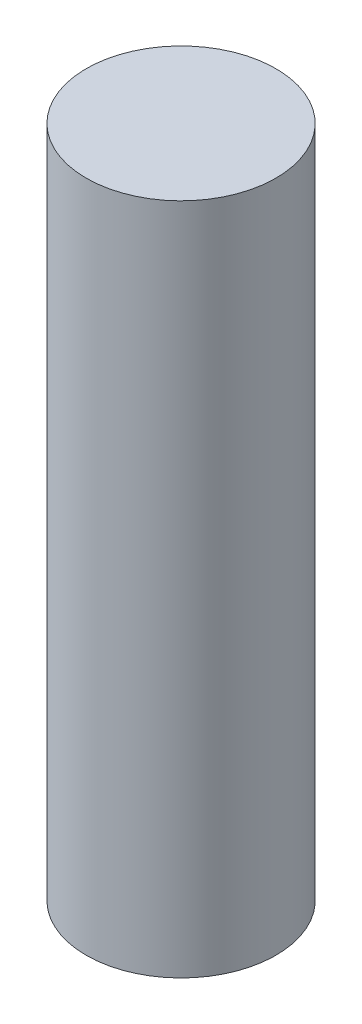
ISO-10303-21;
HEADER;
FILE_DESCRIPTION(('STEP AP214'),'2;1');
FILE_NAME('part.step','',(''),(''),'','','');
FILE_SCHEMA(('AUTOMOTIVE_DESIGN { 1 0 10303 214 1 1 1 1 }'));
ENDSEC;
DATA;
#1=APPLICATION_CONTEXT('core data for automotive mechanical design processes');
#2=APPLICATION_PROTOCOL_DEFINITION('international standard','automotive_design',2000,#1);
#3=PRODUCT_CONTEXT('',#1,'mechanical');
#4=PRODUCT('Part','Part','',(#3));
#5=PRODUCT_RELATED_PRODUCT_CATEGORY('part','',(#4));
#6=PRODUCT_DEFINITION_FORMATION('','',#4);
#7=PRODUCT_DEFINITION_CONTEXT('part definition',#1,'design');
#8=PRODUCT_DEFINITION('design','',#6,#7);
#9=PRODUCT_DEFINITION_SHAPE('','',#8);
#10=(LENGTH_UNIT() NAMED_UNIT(*) SI_UNIT(.MILLI.,.METRE.));
#11=(NAMED_UNIT(*) PLANE_ANGLE_UNIT() SI_UNIT($,.RADIAN.));
#12=(NAMED_UNIT(*) SI_UNIT($,.STERADIAN.) SOLID_ANGLE_UNIT());
#13=UNCERTAINTY_MEASURE_WITH_UNIT(LENGTH_MEASURE(1.E-05),#10,'distance_accuracy_value','');
#14=(GEOMETRIC_REPRESENTATION_CONTEXT(3) GLOBAL_UNCERTAINTY_ASSIGNED_CONTEXT((#13)) GLOBAL_UNIT_ASSIGNED_CONTEXT((#10,
#11,#12)) REPRESENTATION_CONTEXT('',''));
#15=CARTESIAN_POINT('',(0.,0.,0.));
#16=DIRECTION('',(0.,0.,1.));
#17=DIRECTION('',(1.,0.,0.));
#18=AXIS2_PLACEMENT_3D('',#15,#16,#17);
#19=CARTESIAN_POINT('',(0.,33.7,0.));
#20=DIRECTION('',(0.,-1.,0.));
#21=DIRECTION('',(0.,0.,-1.));
#22=AXIS2_PLACEMENT_3D('',#19,#20,#21);
#23=CYLINDRICAL_SURFACE('',#22,4.75);
#24=CARTESIAN_POINT('',(0.,33.7,0.));
#25=DIRECTION('',(0.,1.,0.));
#26=DIRECTION('',(0.,0.,1.));
#27=AXIS2_PLACEMENT_3D('',#24,#25,#26);
#28=CIRCLE('',#27,4.75);
#29=CARTESIAN_POINT('',(0.,33.7,4.75));
#30=VERTEX_POINT('',#29);
#31=EDGE_CURVE('E10',#30,#30,#28,.T.);
#32=ORIENTED_EDGE('',*,*,#31,.F.);
#33=EDGE_LOOP('',(#32));
#34=FACE_BOUND('',#33,.T.);
#35=CARTESIAN_POINT('',(0.,0.,0.));
#36=DIRECTION('',(0.,1.,0.));
#37=DIRECTION('',(0.,0.,1.));
#38=AXIS2_PLACEMENT_3D('',#35,#36,#37);
#39=CIRCLE('',#38,4.75);
#40=CARTESIAN_POINT('',(0.,0.,4.75));
#41=VERTEX_POINT('',#40);
#42=EDGE_CURVE('E44',#41,#41,#39,.T.);
#43=ORIENTED_EDGE('',*,*,#42,.T.);
#44=EDGE_LOOP('',(#43));
#45=FACE_BOUND('',#44,.T.);
#46=ADVANCED_FACE('F41',(#34,#45),#23,.T.);
#47=CARTESIAN_POINT('',(0.,33.7,0.));
#48=DIRECTION('',(0.,1.,0.));
#49=DIRECTION('',(0.,0.,1.));
#50=AXIS2_PLACEMENT_3D('',#47,#48,#49);
#51=PLANE('',#50);
#52=ORIENTED_EDGE('',*,*,#31,.T.);
#53=EDGE_LOOP('',(#52));
#54=FACE_BOUND('',#53,.T.);
#55=ADVANCED_FACE('F74',(#54),#51,.T.);
#56=CARTESIAN_POINT('',(0.,0.,0.));
#57=DIRECTION('',(0.,1.,0.));
#58=DIRECTION('',(0.,0.,1.));
#59=AXIS2_PLACEMENT_3D('',#56,#57,#58);
#60=PLANE('',#59);
#61=CARTESIAN_POINT('',(0.,0.,0.));
#62=DIRECTION('',(0.,-1.,0.));
#63=DIRECTION('',(0.,0.,-1.));
#64=AXIS2_PLACEMENT_3D('',#61,#62,#63);
#65=CIRCLE('',#64,3.25);
#66=CARTESIAN_POINT('',(0.,0.,-3.25));
#67=VERTEX_POINT('',#66);
#68=EDGE_CURVE('E55',#67,#67,#65,.T.);
#69=ORIENTED_EDGE('',*,*,#68,.F.);
#70=EDGE_LOOP('',(#69));
#71=FACE_BOUND('',#70,.T.);
#72=ORIENTED_EDGE('',*,*,#42,.F.);
#73=EDGE_LOOP('',(#72));
#74=FACE_BOUND('',#73,.T.);
#75=ADVANCED_FACE('F68',(#71,#74),#60,.F.);
#76=CARTESIAN_POINT('',(0.,17.,0.));
#77=DIRECTION('',(0.,-1.,0.));
#78=DIRECTION('',(0.,0.,-1.));
#79=AXIS2_PLACEMENT_3D('',#76,#77,#78);
#80=CYLINDRICAL_SURFACE('',#79,3.25);
#81=CARTESIAN_POINT('',(0.,17.,0.));
#82=DIRECTION('',(0.,-1.,0.));
#83=DIRECTION('',(0.,0.,-1.));
#84=AXIS2_PLACEMENT_3D('',#81,#82,#83);
#85=CIRCLE('',#84,3.25);
#86=CARTESIAN_POINT('',(0.,17.,-3.25));
#87=VERTEX_POINT('',#86);
#88=EDGE_CURVE('E53',#87,#87,#85,.T.);
#89=ORIENTED_EDGE('',*,*,#88,.F.);
#90=EDGE_LOOP('',(#89));
#91=FACE_BOUND('',#90,.T.);
#92=ORIENTED_EDGE('',*,*,#68,.T.);
#93=EDGE_LOOP('',(#92));
#94=FACE_BOUND('',#93,.T.);
#95=ADVANCED_FACE('F65',(#91,#94),#80,.F.);
#96=CARTESIAN_POINT('',(0.,17.,0.));
#97=DIRECTION('',(0.,-1.,0.));
#98=DIRECTION('',(0.,0.,-1.));
#99=AXIS2_PLACEMENT_3D('',#96,#97,#98);
#100=PLANE('',#99);
#101=ORIENTED_EDGE('',*,*,#88,.T.);
#102=EDGE_LOOP('',(#101));
#103=FACE_BOUND('',#102,.T.);
#104=ADVANCED_FACE('F63',(#103),#100,.T.);
#105=CLOSED_SHELL('',(#46,#55,#75,#95,#104));
#106=MANIFOLD_SOLID_BREP('B2',#105);
#107=ADVANCED_BREP_SHAPE_REPRESENTATION('',(#18,#106),#14);
#108=SHAPE_DEFINITION_REPRESENTATION(#9,#107);
ENDSEC;
END-ISO-10303-21;
